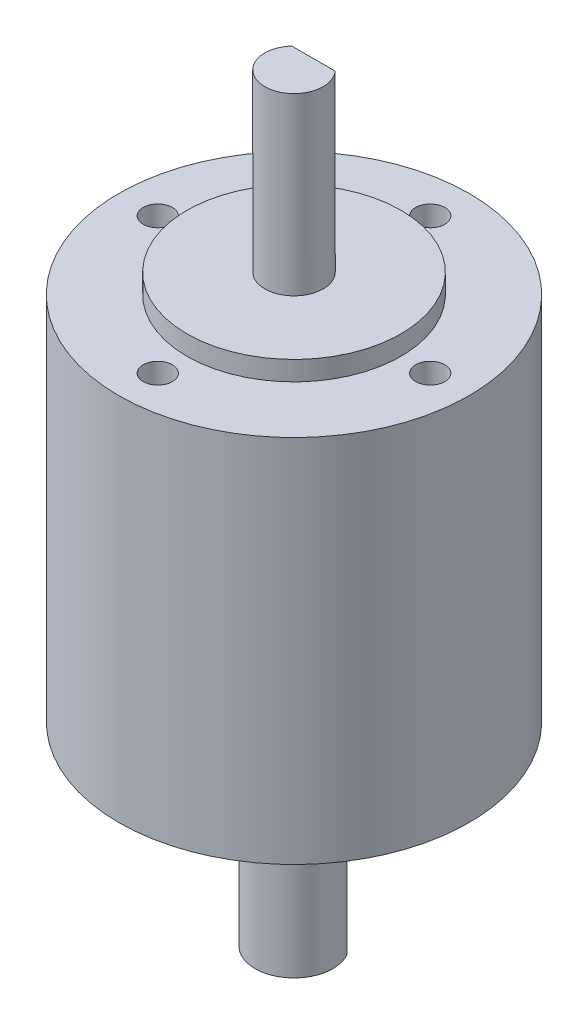
ISO-10303-21;
HEADER;
FILE_DESCRIPTION(('STEP AP214'),'2;1');
FILE_NAME('part.step','',(''),(''),'','','');
FILE_SCHEMA(('AUTOMOTIVE_DESIGN { 1 0 10303 214 1 1 1 1 }'));
ENDSEC;
DATA;
#1=APPLICATION_CONTEXT('core data for automotive mechanical design processes');
#2=APPLICATION_PROTOCOL_DEFINITION('international standard','automotive_design',2000,#1);
#3=PRODUCT_CONTEXT('',#1,'mechanical');
#4=PRODUCT('Part','Part','',(#3));
#5=PRODUCT_RELATED_PRODUCT_CATEGORY('part','',(#4));
#6=PRODUCT_DEFINITION_FORMATION('','',#4);
#7=PRODUCT_DEFINITION_CONTEXT('part definition',#1,'design');
#8=PRODUCT_DEFINITION('design','',#6,#7);
#9=PRODUCT_DEFINITION_SHAPE('','',#8);
#10=(LENGTH_UNIT() NAMED_UNIT(*) SI_UNIT(.MILLI.,.METRE.));
#11=(NAMED_UNIT(*) PLANE_ANGLE_UNIT() SI_UNIT($,.RADIAN.));
#12=(NAMED_UNIT(*) SI_UNIT($,.STERADIAN.) SOLID_ANGLE_UNIT());
#13=UNCERTAINTY_MEASURE_WITH_UNIT(LENGTH_MEASURE(1.E-05),#10,'distance_accuracy_value','');
#14=(GEOMETRIC_REPRESENTATION_CONTEXT(3) GLOBAL_UNCERTAINTY_ASSIGNED_CONTEXT((#13)) GLOBAL_UNIT_ASSIGNED_CONTEXT((#10,
#11,#12)) REPRESENTATION_CONTEXT('',''));
#15=CARTESIAN_POINT('',(0.,0.,0.));
#16=DIRECTION('',(0.,0.,1.));
#17=DIRECTION('',(1.,0.,0.));
#18=AXIS2_PLACEMENT_3D('',#15,#16,#17);
#19=CARTESIAN_POINT('',(0.,38.,0.));
#20=DIRECTION('',(0.,-1.,0.));
#21=DIRECTION('',(0.,0.,-1.));
#22=AXIS2_PLACEMENT_3D('',#19,#20,#21);
#23=CYLINDRICAL_SURFACE('',#22,18.);
#24=CARTESIAN_POINT('',(0.,38.,0.));
#25=DIRECTION('',(0.,1.,0.));
#26=DIRECTION('',(0.,0.,1.));
#27=AXIS2_PLACEMENT_3D('',#24,#25,#26);
#28=CIRCLE('',#27,18.);
#29=CARTESIAN_POINT('',(0.,38.,18.));
#30=VERTEX_POINT('',#29);
#31=EDGE_CURVE('E127',#30,#30,#28,.T.);
#32=ORIENTED_EDGE('',*,*,#31,.F.);
#33=EDGE_LOOP('',(#32));
#34=FACE_BOUND('',#33,.T.);
#35=CARTESIAN_POINT('',(0.,0.,0.));
#36=DIRECTION('',(0.,1.,0.));
#37=DIRECTION('',(0.,0.,1.));
#38=AXIS2_PLACEMENT_3D('',#35,#36,#37);
#39=CIRCLE('',#38,18.);
#40=CARTESIAN_POINT('',(0.,0.,18.));
#41=VERTEX_POINT('',#40);
#42=EDGE_CURVE('E123',#41,#41,#39,.T.);
#43=ORIENTED_EDGE('',*,*,#42,.T.);
#44=EDGE_LOOP('',(#43));
#45=FACE_BOUND('',#44,.T.);
#46=ADVANCED_FACE('F40',(#34,#45),#23,.T.);
#47=CARTESIAN_POINT('',(0.,38.,0.));
#48=DIRECTION('',(0.,1.,0.));
#49=DIRECTION('',(0.,0.,1.));
#50=AXIS2_PLACEMENT_3D('',#47,#48,#49);
#51=PLANE('',#50);
#52=CARTESIAN_POINT('',(-14.,38.,0.));
#53=DIRECTION('',(0.,1.,0.));
#54=DIRECTION('',(0.,0.,1.));
#55=AXIS2_PLACEMENT_3D('',#52,#53,#54);
#56=CIRCLE('',#55,1.5);
#57=CARTESIAN_POINT('',(-14.,38.,1.5));
#58=VERTEX_POINT('',#57);
#59=EDGE_CURVE('E538',#58,#58,#56,.T.);
#60=ORIENTED_EDGE('',*,*,#59,.F.);
#61=EDGE_LOOP('',(#60));
#62=FACE_BOUND('',#61,.T.);
#63=CARTESIAN_POINT('',(0.,38.,-14.));
#64=DIRECTION('',(0.,1.,0.));
#65=DIRECTION('',(0.,0.,1.));
#66=AXIS2_PLACEMENT_3D('',#63,#64,#65);
#67=CIRCLE('',#66,1.5);
#68=CARTESIAN_POINT('',(0.,38.,-12.5));
#69=VERTEX_POINT('',#68);
#70=EDGE_CURVE('E548',#69,#69,#67,.T.);
#71=ORIENTED_EDGE('',*,*,#70,.F.);
#72=EDGE_LOOP('',(#71));
#73=FACE_BOUND('',#72,.T.);
#74=CARTESIAN_POINT('',(14.,38.,0.));
#75=DIRECTION('',(0.,1.,0.));
#76=DIRECTION('',(0.,0.,1.));
#77=AXIS2_PLACEMENT_3D('',#74,#75,#76);
#78=CIRCLE('',#77,1.5);
#79=CARTESIAN_POINT('',(14.,38.,1.5));
#80=VERTEX_POINT('',#79);
#81=EDGE_CURVE('E554',#80,#80,#78,.T.);
#82=ORIENTED_EDGE('',*,*,#81,.F.);
#83=EDGE_LOOP('',(#82));
#84=FACE_BOUND('',#83,.T.);
#85=CARTESIAN_POINT('',(0.,38.,14.));
#86=DIRECTION('',(0.,1.,0.));
#87=DIRECTION('',(0.,0.,1.));
#88=AXIS2_PLACEMENT_3D('',#85,#86,#87);
#89=CIRCLE('',#88,1.5);
#90=CARTESIAN_POINT('',(0.,38.,15.5));
#91=VERTEX_POINT('',#90);
#92=EDGE_CURVE('E561',#91,#91,#89,.T.);
#93=ORIENTED_EDGE('',*,*,#92,.F.);
#94=EDGE_LOOP('',(#93));
#95=FACE_BOUND('',#94,.T.);
#96=CARTESIAN_POINT('',(0.,38.,0.));
#97=DIRECTION('',(0.,1.,0.));
#98=DIRECTION('',(0.,0.,1.));
#99=AXIS2_PLACEMENT_3D('',#96,#97,#98);
#100=CIRCLE('',#99,11.);
#101=CARTESIAN_POINT('',(0.,38.,11.));
#102=VERTEX_POINT('',#101);
#103=EDGE_CURVE('E120',#102,#102,#100,.T.);
#104=ORIENTED_EDGE('',*,*,#103,.F.);
#105=EDGE_LOOP('',(#104));
#106=FACE_BOUND('',#105,.T.);
#107=ORIENTED_EDGE('',*,*,#31,.T.);
#108=EDGE_LOOP('',(#107));
#109=FACE_BOUND('',#108,.T.);
#110=ADVANCED_FACE('F211',(#62,#73,#84,#95,#106,#109),#51,.T.);
#111=CARTESIAN_POINT('',(0.,0.,0.));
#112=DIRECTION('',(0.,1.,0.));
#113=DIRECTION('',(0.,0.,1.));
#114=AXIS2_PLACEMENT_3D('',#111,#112,#113);
#115=PLANE('',#114);
#116=CARTESIAN_POINT('',(0.,0.,14.));
#117=DIRECTION('',(0.,-1.,0.));
#118=DIRECTION('',(0.,0.,-1.));
#119=AXIS2_PLACEMENT_3D('',#116,#117,#118);
#120=CIRCLE('',#119,1.5);
#121=CARTESIAN_POINT('',(0.,0.,12.5));
#122=VERTEX_POINT('',#121);
#123=EDGE_CURVE('E160',#122,#122,#120,.T.);
#124=ORIENTED_EDGE('',*,*,#123,.F.);
#125=EDGE_LOOP('',(#124));
#126=FACE_BOUND('',#125,.T.);
#127=CARTESIAN_POINT('',(14.,0.,0.));
#128=DIRECTION('',(0.,-1.,0.));
#129=DIRECTION('',(0.,0.,-1.));
#130=AXIS2_PLACEMENT_3D('',#127,#128,#129);
#131=CIRCLE('',#130,1.5);
#132=CARTESIAN_POINT('',(14.,0.,-1.5));
#133=VERTEX_POINT('',#132);
#134=EDGE_CURVE('E172',#133,#133,#131,.T.);
#135=ORIENTED_EDGE('',*,*,#134,.F.);
#136=EDGE_LOOP('',(#135));
#137=FACE_BOUND('',#136,.T.);
#138=CARTESIAN_POINT('',(0.,0.,-14.));
#139=DIRECTION('',(0.,-1.,0.));
#140=DIRECTION('',(0.,0.,-1.));
#141=AXIS2_PLACEMENT_3D('',#138,#139,#140);
#142=CIRCLE('',#141,1.5);
#143=CARTESIAN_POINT('',(0.,0.,-15.5));
#144=VERTEX_POINT('',#143);
#145=EDGE_CURVE('E183',#144,#144,#142,.T.);
#146=ORIENTED_EDGE('',*,*,#145,.F.);
#147=EDGE_LOOP('',(#146));
#148=FACE_BOUND('',#147,.T.);
#149=CARTESIAN_POINT('',(-14.,0.,0.));
#150=DIRECTION('',(0.,-1.,0.));
#151=DIRECTION('',(0.,0.,-1.));
#152=AXIS2_PLACEMENT_3D('',#149,#150,#151);
#153=CIRCLE('',#152,1.5);
#154=CARTESIAN_POINT('',(-14.,0.,-1.5));
#155=VERTEX_POINT('',#154);
#156=EDGE_CURVE('E191',#155,#155,#153,.T.);
#157=ORIENTED_EDGE('',*,*,#156,.F.);
#158=EDGE_LOOP('',(#157));
#159=FACE_BOUND('',#158,.T.);
#160=CARTESIAN_POINT('',(0.,0.,0.));
#161=DIRECTION('',(0.,-1.,0.));
#162=DIRECTION('',(0.,0.,-1.));
#163=AXIS2_PLACEMENT_3D('',#160,#161,#162);
#164=CIRCLE('',#163,11.);
#165=CARTESIAN_POINT('',(0.,0.,-11.));
#166=VERTEX_POINT('',#165);
#167=EDGE_CURVE('E115',#166,#166,#164,.T.);
#168=ORIENTED_EDGE('',*,*,#167,.F.);
#169=EDGE_LOOP('',(#168));
#170=FACE_BOUND('',#169,.T.);
#171=ORIENTED_EDGE('',*,*,#42,.F.);
#172=EDGE_LOOP('',(#171));
#173=FACE_BOUND('',#172,.T.);
#174=ADVANCED_FACE('F216',(#126,#137,#148,#159,#170,#173),#115,.F.);
#175=CARTESIAN_POINT('',(0.,40.,0.));
#176=DIRECTION('',(0.,-1.,0.));
#177=DIRECTION('',(0.,0.,-1.));
#178=AXIS2_PLACEMENT_3D('',#175,#176,#177);
#179=CYLINDRICAL_SURFACE('',#178,11.);
#180=CARTESIAN_POINT('',(0.,40.,0.));
#181=DIRECTION('',(0.,1.,0.));
#182=DIRECTION('',(0.,0.,1.));
#183=AXIS2_PLACEMENT_3D('',#180,#181,#182);
#184=CIRCLE('',#183,11.);
#185=CARTESIAN_POINT('',(0.,40.,11.));
#186=VERTEX_POINT('',#185);
#187=EDGE_CURVE('E104',#186,#186,#184,.T.);
#188=ORIENTED_EDGE('',*,*,#187,.F.);
#189=EDGE_LOOP('',(#188));
#190=FACE_BOUND('',#189,.T.);
#191=ORIENTED_EDGE('',*,*,#103,.T.);
#192=EDGE_LOOP('',(#191));
#193=FACE_BOUND('',#192,.T.);
#194=ADVANCED_FACE('F224',(#190,#193),#179,.T.);
#195=CARTESIAN_POINT('',(0.,40.,0.));
#196=DIRECTION('',(0.,1.,0.));
#197=DIRECTION('',(0.,0.,1.));
#198=AXIS2_PLACEMENT_3D('',#195,#196,#197);
#199=PLANE('',#198);
#200=CARTESIAN_POINT('',(0.,40.,0.));
#201=DIRECTION('',(0.,1.,0.));
#202=DIRECTION('',(0.,0.,1.));
#203=AXIS2_PLACEMENT_3D('',#200,#201,#202);
#204=CIRCLE('',#203,3.);
#205=CARTESIAN_POINT('',(0.,40.,3.));
#206=VERTEX_POINT('',#205);
#207=EDGE_CURVE('E111',#206,#206,#204,.T.);
#208=ORIENTED_EDGE('',*,*,#207,.F.);
#209=EDGE_LOOP('',(#208));
#210=FACE_BOUND('',#209,.T.);
#211=ORIENTED_EDGE('',*,*,#187,.T.);
#212=EDGE_LOOP('',(#211));
#213=FACE_BOUND('',#212,.T.);
#214=ADVANCED_FACE('F229',(#210,#213),#199,.T.);
#215=CARTESIAN_POINT('',(0.,-2.,0.));
#216=DIRECTION('',(0.,1.,0.));
#217=DIRECTION('',(0.,0.,1.));
#218=AXIS2_PLACEMENT_3D('',#215,#216,#217);
#219=CYLINDRICAL_SURFACE('',#218,11.);
#220=CARTESIAN_POINT('',(0.,-2.,0.));
#221=DIRECTION('',(0.,-1.,0.));
#222=DIRECTION('',(0.,0.,-1.));
#223=AXIS2_PLACEMENT_3D('',#220,#221,#222);
#224=CIRCLE('',#223,11.);
#225=CARTESIAN_POINT('',(0.,-2.,-11.));
#226=VERTEX_POINT('',#225);
#227=EDGE_CURVE('E98',#226,#226,#224,.T.);
#228=ORIENTED_EDGE('',*,*,#227,.F.);
#229=EDGE_LOOP('',(#228));
#230=FACE_BOUND('',#229,.T.);
#231=ORIENTED_EDGE('',*,*,#167,.T.);
#232=EDGE_LOOP('',(#231));
#233=FACE_BOUND('',#232,.T.);
#234=ADVANCED_FACE('F236',(#230,#233),#219,.T.);
#235=CARTESIAN_POINT('',(0.,-2.,0.));
#236=DIRECTION('',(0.,-1.,0.));
#237=DIRECTION('',(0.,0.,-1.));
#238=AXIS2_PLACEMENT_3D('',#235,#236,#237);
#239=PLANE('',#238);
#240=CARTESIAN_POINT('',(0.,-2.,0.));
#241=DIRECTION('',(0.,-1.,0.));
#242=DIRECTION('',(0.,0.,-1.));
#243=AXIS2_PLACEMENT_3D('',#240,#241,#242);
#244=CIRCLE('',#243,4.);
#245=CARTESIAN_POINT('',(0.,-2.,-4.));
#246=VERTEX_POINT('',#245);
#247=EDGE_CURVE('E112',#246,#246,#244,.T.);
#248=ORIENTED_EDGE('',*,*,#247,.F.);
#249=EDGE_LOOP('',(#248));
#250=FACE_BOUND('',#249,.T.);
#251=ORIENTED_EDGE('',*,*,#227,.T.);
#252=EDGE_LOOP('',(#251));
#253=FACE_BOUND('',#252,.T.);
#254=ADVANCED_FACE('F240',(#250,#253),#239,.T.);
#255=CARTESIAN_POINT('',(0.,-20.,0.));
#256=DIRECTION('',(0.,1.,0.));
#257=DIRECTION('',(0.,0.,1.));
#258=AXIS2_PLACEMENT_3D('',#255,#256,#257);
#259=CYLINDRICAL_SURFACE('',#258,4.);
#260=CARTESIAN_POINT('',(0.,-20.,0.));
#261=DIRECTION('',(0.,-1.,0.));
#262=DIRECTION('',(0.,0.,-1.));
#263=AXIS2_PLACEMENT_3D('',#260,#261,#262);
#264=CIRCLE('',#263,4.);
#265=CARTESIAN_POINT('',(3.46410161513775,-20.,-2.));
#266=VERTEX_POINT('',#265);
#267=CARTESIAN_POINT('',(-3.46410161513775,-20.,-2.));
#268=VERTEX_POINT('',#267);
#269=EDGE_CURVE('E92',#266,#268,#264,.T.);
#270=ORIENTED_EDGE('',*,*,#269,.F.);
#271=DIRECTION('',(0.,1.,0.));
#272=VECTOR('',#271,1.);
#273=CARTESIAN_POINT('',(3.46410161513775,-20.,-2.));
#274=LINE('',#273,#272);
#275=CARTESIAN_POINT('',(3.46410161513775,-5.,-2.));
#276=VERTEX_POINT('',#275);
#277=EDGE_CURVE('E55',#266,#276,#274,.T.);
#278=ORIENTED_EDGE('',*,*,#277,.T.);
#279=CARTESIAN_POINT('',(0.,-5.,0.));
#280=DIRECTION('',(0.,-1.,0.));
#281=DIRECTION('',(0.,0.,-1.));
#282=AXIS2_PLACEMENT_3D('',#279,#280,#281);
#283=CIRCLE('',#282,4.);
#284=CARTESIAN_POINT('',(-3.46410161513775,-5.,-2.));
#285=VERTEX_POINT('',#284);
#286=EDGE_CURVE('E11',#285,#276,#283,.T.);
#287=ORIENTED_EDGE('',*,*,#286,.F.);
#288=DIRECTION('',(0.,1.,0.));
#289=VECTOR('',#288,1.);
#290=CARTESIAN_POINT('',(-3.46410161513775,-20.,-2.));
#291=LINE('',#290,#289);
#292=EDGE_CURVE('E81',#285,#268,#291,.F.);
#293=ORIENTED_EDGE('',*,*,#292,.T.);
#294=EDGE_LOOP('',(#270,#278,#287,#293));
#295=FACE_BOUND('',#294,.T.);
#296=ORIENTED_EDGE('',*,*,#247,.T.);
#297=EDGE_LOOP('',(#296));
#298=FACE_BOUND('',#297,.T.);
#299=ADVANCED_FACE('F90',(#295,#298),#259,.T.);
#300=CARTESIAN_POINT('',(0.,-20.,0.));
#301=DIRECTION('',(0.,-1.,0.));
#302=DIRECTION('',(0.,0.,-1.));
#303=AXIS2_PLACEMENT_3D('',#300,#301,#302);
#304=PLANE('',#303);
#305=DIRECTION('',(-1.,0.,0.));
#306=VECTOR('',#305,1.);
#307=CARTESIAN_POINT('',(0.,-20.,-2.));
#308=LINE('',#307,#306);
#309=EDGE_CURVE('E48',#266,#268,#308,.T.);
#310=ORIENTED_EDGE('',*,*,#309,.F.);
#311=ORIENTED_EDGE('',*,*,#269,.T.);
#312=EDGE_LOOP('',(#310,#311));
#313=FACE_BOUND('',#312,.T.);
#314=ADVANCED_FACE('F96',(#313),#304,.T.);
#315=CARTESIAN_POINT('',(0.,58.,0.));
#316=DIRECTION('',(0.,-1.,0.));
#317=DIRECTION('',(0.,0.,-1.));
#318=AXIS2_PLACEMENT_3D('',#315,#316,#317);
#319=CYLINDRICAL_SURFACE('',#318,3.);
#320=CARTESIAN_POINT('',(0.,58.,0.));
#321=DIRECTION('',(0.,1.,0.));
#322=DIRECTION('',(0.,0.,1.));
#323=AXIS2_PLACEMENT_3D('',#320,#321,#322);
#324=CIRCLE('',#323,3.);
#325=CARTESIAN_POINT('',(-2.23606797749979,58.,-2.));
#326=VERTEX_POINT('',#325);
#327=CARTESIAN_POINT('',(2.23606797749979,58.,-2.));
#328=VERTEX_POINT('',#327);
#329=EDGE_CURVE('E99',#326,#328,#324,.T.);
#330=ORIENTED_EDGE('',*,*,#329,.F.);
#331=DIRECTION('',(0.,-1.,0.));
#332=VECTOR('',#331,1.);
#333=CARTESIAN_POINT('',(-2.23606797749979,58.,-2.));
#334=LINE('',#333,#332);
#335=CARTESIAN_POINT('',(-2.23606797749979,43.,-2.));
#336=VERTEX_POINT('',#335);
#337=EDGE_CURVE('E63',#326,#336,#334,.T.);
#338=ORIENTED_EDGE('',*,*,#337,.T.);
#339=CARTESIAN_POINT('',(0.,43.,0.));
#340=DIRECTION('',(0.,-1.,0.));
#341=DIRECTION('',(0.,0.,-1.));
#342=AXIS2_PLACEMENT_3D('',#339,#340,#341);
#343=CIRCLE('',#342,3.);
#344=CARTESIAN_POINT('',(2.23606797749979,43.,-2.));
#345=VERTEX_POINT('',#344);
#346=EDGE_CURVE('E87',#336,#345,#343,.T.);
#347=ORIENTED_EDGE('',*,*,#346,.T.);
#348=DIRECTION('',(0.,-1.,0.));
#349=VECTOR('',#348,1.);
#350=CARTESIAN_POINT('',(2.23606797749979,58.,-2.));
#351=LINE('',#350,#349);
#352=EDGE_CURVE('E145',#345,#328,#351,.F.);
#353=ORIENTED_EDGE('',*,*,#352,.T.);
#354=EDGE_LOOP('',(#330,#338,#347,#353));
#355=FACE_BOUND('',#354,.T.);
#356=ORIENTED_EDGE('',*,*,#207,.T.);
#357=EDGE_LOOP('',(#356));
#358=FACE_BOUND('',#357,.T.);
#359=ADVANCED_FACE('F143',(#355,#358),#319,.T.);
#360=CARTESIAN_POINT('',(0.,58.,0.));
#361=DIRECTION('',(0.,1.,0.));
#362=DIRECTION('',(0.,0.,1.));
#363=AXIS2_PLACEMENT_3D('',#360,#361,#362);
#364=PLANE('',#363);
#365=DIRECTION('',(1.,0.,0.));
#366=VECTOR('',#365,1.);
#367=CARTESIAN_POINT('',(0.,58.,-2.));
#368=LINE('',#367,#366);
#369=EDGE_CURVE('E134',#326,#328,#368,.T.);
#370=ORIENTED_EDGE('',*,*,#369,.F.);
#371=ORIENTED_EDGE('',*,*,#329,.T.);
#372=EDGE_LOOP('',(#370,#371));
#373=FACE_BOUND('',#372,.T.);
#374=ADVANCED_FACE('F251',(#373),#364,.T.);
#375=CARTESIAN_POINT('',(0.,43.,0.));
#376=DIRECTION('',(0.,-1.,0.));
#377=DIRECTION('',(0.,0.,-1.));
#378=AXIS2_PLACEMENT_3D('',#375,#376,#377);
#379=PLANE('',#378);
#380=DIRECTION('',(1.,0.,0.));
#381=VECTOR('',#380,1.);
#382=CARTESIAN_POINT('',(-4.7940074906367,43.,-2.));
#383=LINE('',#382,#381);
#384=EDGE_CURVE('E149',#336,#345,#383,.T.);
#385=ORIENTED_EDGE('',*,*,#384,.T.);
#386=ORIENTED_EDGE('',*,*,#346,.F.);
#387=EDGE_LOOP('',(#385,#386));
#388=FACE_BOUND('',#387,.T.);
#389=ADVANCED_FACE('F148',(#388),#379,.F.);
#390=CARTESIAN_POINT('',(-4.7940074906367,43.,-2.));
#391=DIRECTION('',(0.,0.,1.));
#392=DIRECTION('',(1.,0.,0.));
#393=AXIS2_PLACEMENT_3D('',#390,#391,#392);
#394=PLANE('',#393);
#395=ORIENTED_EDGE('',*,*,#369,.T.);
#396=ORIENTED_EDGE('',*,*,#352,.F.);
#397=ORIENTED_EDGE('',*,*,#384,.F.);
#398=ORIENTED_EDGE('',*,*,#337,.F.);
#399=EDGE_LOOP('',(#395,#396,#397,#398));
#400=FACE_BOUND('',#399,.T.);
#401=ADVANCED_FACE('F150',(#400),#394,.F.);
#402=CARTESIAN_POINT('',(0.,-5.,0.));
#403=DIRECTION('',(0.,-1.,0.));
#404=DIRECTION('',(0.,0.,-1.));
#405=AXIS2_PLACEMENT_3D('',#402,#403,#404);
#406=PLANE('',#405);
#407=ORIENTED_EDGE('',*,*,#286,.T.);
#408=DIRECTION('',(-1.,0.,0.));
#409=VECTOR('',#408,1.);
#410=CARTESIAN_POINT('',(4.45842696629214,-5.,-2.));
#411=LINE('',#410,#409);
#412=EDGE_CURVE('E94',#276,#285,#411,.T.);
#413=ORIENTED_EDGE('',*,*,#412,.T.);
#414=EDGE_LOOP('',(#407,#413));
#415=FACE_BOUND('',#414,.T.);
#416=ADVANCED_FACE('F199',(#415),#406,.T.);
#417=CARTESIAN_POINT('',(4.45842696629214,-5.,-2.));
#418=DIRECTION('',(0.,0.,1.));
#419=DIRECTION('',(1.,0.,0.));
#420=AXIS2_PLACEMENT_3D('',#417,#418,#419);
#421=PLANE('',#420);
#422=ORIENTED_EDGE('',*,*,#309,.T.);
#423=ORIENTED_EDGE('',*,*,#292,.F.);
#424=ORIENTED_EDGE('',*,*,#412,.F.);
#425=ORIENTED_EDGE('',*,*,#277,.F.);
#426=EDGE_LOOP('',(#422,#423,#424,#425));
#427=FACE_BOUND('',#426,.T.);
#428=ADVANCED_FACE('F80',(#427),#421,.F.);
#429=CARTESIAN_POINT('',(-14.,6.,0.));
#430=DIRECTION('',(0.,-1.,0.));
#431=DIRECTION('',(0.,0.,-1.));
#432=AXIS2_PLACEMENT_3D('',#429,#430,#431);
#433=CYLINDRICAL_SURFACE('',#432,1.5);
#434=CARTESIAN_POINT('',(-14.,6.,0.));
#435=DIRECTION('',(0.,-1.,0.));
#436=DIRECTION('',(0.,0.,-1.));
#437=AXIS2_PLACEMENT_3D('',#434,#435,#436);
#438=CIRCLE('',#437,1.5);
#439=CARTESIAN_POINT('',(-14.,6.,-1.5));
#440=VERTEX_POINT('',#439);
#441=EDGE_CURVE('E187',#440,#440,#438,.T.);
#442=ORIENTED_EDGE('',*,*,#441,.F.);
#443=EDGE_LOOP('',(#442));
#444=FACE_BOUND('',#443,.T.);
#445=ORIENTED_EDGE('',*,*,#156,.T.);
#446=EDGE_LOOP('',(#445));
#447=FACE_BOUND('',#446,.T.);
#448=ADVANCED_FACE('F206',(#444,#447),#433,.F.);
#449=CARTESIAN_POINT('',(-14.,6.,0.));
#450=DIRECTION('',(0.,-1.,0.));
#451=DIRECTION('',(0.,0.,-1.));
#452=AXIS2_PLACEMENT_3D('',#449,#450,#451);
#453=PLANE('',#452);
#454=ORIENTED_EDGE('',*,*,#441,.T.);
#455=EDGE_LOOP('',(#454));
#456=FACE_BOUND('',#455,.T.);
#457=ADVANCED_FACE('F281',(#456),#453,.T.);
#458=CARTESIAN_POINT('',(0.,6.,-14.));
#459=DIRECTION('',(0.,-1.,0.));
#460=DIRECTION('',(0.,0.,-1.));
#461=AXIS2_PLACEMENT_3D('',#458,#459,#460);
#462=CYLINDRICAL_SURFACE('',#461,1.5);
#463=CARTESIAN_POINT('',(0.,6.,-14.));
#464=DIRECTION('',(0.,-1.,0.));
#465=DIRECTION('',(0.,0.,-1.));
#466=AXIS2_PLACEMENT_3D('',#463,#464,#465);
#467=CIRCLE('',#466,1.5);
#468=CARTESIAN_POINT('',(0.,6.,-15.5));
#469=VERTEX_POINT('',#468);
#470=EDGE_CURVE('E179',#469,#469,#467,.T.);
#471=ORIENTED_EDGE('',*,*,#470,.F.);
#472=EDGE_LOOP('',(#471));
#473=FACE_BOUND('',#472,.T.);
#474=ORIENTED_EDGE('',*,*,#145,.T.);
#475=EDGE_LOOP('',(#474));
#476=FACE_BOUND('',#475,.T.);
#477=ADVANCED_FACE('F289',(#473,#476),#462,.F.);
#478=CARTESIAN_POINT('',(0.,6.,-14.));
#479=DIRECTION('',(0.,-1.,0.));
#480=DIRECTION('',(0.,0.,-1.));
#481=AXIS2_PLACEMENT_3D('',#478,#479,#480);
#482=PLANE('',#481);
#483=ORIENTED_EDGE('',*,*,#470,.T.);
#484=EDGE_LOOP('',(#483));
#485=FACE_BOUND('',#484,.T.);
#486=ADVANCED_FACE('F298',(#485),#482,.T.);
#487=CARTESIAN_POINT('',(14.,6.,0.));
#488=DIRECTION('',(0.,-1.,0.));
#489=DIRECTION('',(0.,0.,-1.));
#490=AXIS2_PLACEMENT_3D('',#487,#488,#489);
#491=CYLINDRICAL_SURFACE('',#490,1.5);
#492=CARTESIAN_POINT('',(14.,6.,0.));
#493=DIRECTION('',(0.,-1.,0.));
#494=DIRECTION('',(0.,0.,-1.));
#495=AXIS2_PLACEMENT_3D('',#492,#493,#494);
#496=CIRCLE('',#495,1.5);
#497=CARTESIAN_POINT('',(14.,6.,-1.5));
#498=VERTEX_POINT('',#497);
#499=EDGE_CURVE('E163',#498,#498,#496,.T.);
#500=ORIENTED_EDGE('',*,*,#499,.F.);
#501=EDGE_LOOP('',(#500));
#502=FACE_BOUND('',#501,.T.);
#503=ORIENTED_EDGE('',*,*,#134,.T.);
#504=EDGE_LOOP('',(#503));
#505=FACE_BOUND('',#504,.T.);
#506=ADVANCED_FACE('F307',(#502,#505),#491,.F.);
#507=CARTESIAN_POINT('',(14.,6.,0.));
#508=DIRECTION('',(0.,-1.,0.));
#509=DIRECTION('',(0.,0.,-1.));
#510=AXIS2_PLACEMENT_3D('',#507,#508,#509);
#511=PLANE('',#510);
#512=ORIENTED_EDGE('',*,*,#499,.T.);
#513=EDGE_LOOP('',(#512));
#514=FACE_BOUND('',#513,.T.);
#515=ADVANCED_FACE('F316',(#514),#511,.T.);
#516=CARTESIAN_POINT('',(0.,6.,14.));
#517=DIRECTION('',(0.,-1.,0.));
#518=DIRECTION('',(0.,0.,-1.));
#519=AXIS2_PLACEMENT_3D('',#516,#517,#518);
#520=CYLINDRICAL_SURFACE('',#519,1.5);
#521=CARTESIAN_POINT('',(0.,6.,14.));
#522=DIRECTION('',(0.,-1.,0.));
#523=DIRECTION('',(0.,0.,-1.));
#524=AXIS2_PLACEMENT_3D('',#521,#522,#523);
#525=CIRCLE('',#524,1.5);
#526=CARTESIAN_POINT('',(0.,6.,12.5));
#527=VERTEX_POINT('',#526);
#528=EDGE_CURVE('E162',#527,#527,#525,.T.);
#529=ORIENTED_EDGE('',*,*,#528,.F.);
#530=EDGE_LOOP('',(#529));
#531=FACE_BOUND('',#530,.T.);
#532=ORIENTED_EDGE('',*,*,#123,.T.);
#533=EDGE_LOOP('',(#532));
#534=FACE_BOUND('',#533,.T.);
#535=ADVANCED_FACE('F325',(#531,#534),#520,.F.);
#536=CARTESIAN_POINT('',(0.,6.,14.));
#537=DIRECTION('',(0.,-1.,0.));
#538=DIRECTION('',(0.,0.,-1.));
#539=AXIS2_PLACEMENT_3D('',#536,#537,#538);
#540=PLANE('',#539);
#541=ORIENTED_EDGE('',*,*,#528,.T.);
#542=EDGE_LOOP('',(#541));
#543=FACE_BOUND('',#542,.T.);
#544=ADVANCED_FACE('F334',(#543),#540,.T.);
#545=CARTESIAN_POINT('',(0.,32.,14.));
#546=DIRECTION('',(0.,1.,0.));
#547=DIRECTION('',(0.,0.,1.));
#548=AXIS2_PLACEMENT_3D('',#545,#546,#547);
#549=CYLINDRICAL_SURFACE('',#548,1.5);
#550=CARTESIAN_POINT('',(0.,32.,14.));
#551=DIRECTION('',(0.,1.,0.));
#552=DIRECTION('',(0.,0.,1.));
#553=AXIS2_PLACEMENT_3D('',#550,#551,#552);
#554=CIRCLE('',#553,1.5);
#555=CARTESIAN_POINT('',(0.,32.,15.5));
#556=VERTEX_POINT('',#555);
#557=EDGE_CURVE('E558',#556,#556,#554,.T.);
#558=ORIENTED_EDGE('',*,*,#557,.F.);
#559=EDGE_LOOP('',(#558));
#560=FACE_BOUND('',#559,.T.);
#561=ORIENTED_EDGE('',*,*,#92,.T.);
#562=EDGE_LOOP('',(#561));
#563=FACE_BOUND('',#562,.T.);
#564=ADVANCED_FACE('F343',(#560,#563),#549,.F.);
#565=CARTESIAN_POINT('',(0.,32.,14.));
#566=DIRECTION('',(0.,1.,0.));
#567=DIRECTION('',(0.,0.,1.));
#568=AXIS2_PLACEMENT_3D('',#565,#566,#567);
#569=PLANE('',#568);
#570=ORIENTED_EDGE('',*,*,#557,.T.);
#571=EDGE_LOOP('',(#570));
#572=FACE_BOUND('',#571,.T.);
#573=ADVANCED_FACE('F353',(#572),#569,.T.);
#574=CARTESIAN_POINT('',(14.,32.,0.));
#575=DIRECTION('',(0.,1.,0.));
#576=DIRECTION('',(0.,0.,1.));
#577=AXIS2_PLACEMENT_3D('',#574,#575,#576);
#578=CYLINDRICAL_SURFACE('',#577,1.5);
#579=CARTESIAN_POINT('',(14.,32.,0.));
#580=DIRECTION('',(0.,1.,0.));
#581=DIRECTION('',(0.,0.,1.));
#582=AXIS2_PLACEMENT_3D('',#579,#580,#581);
#583=CIRCLE('',#582,1.5);
#584=CARTESIAN_POINT('',(14.,32.,1.5));
#585=VERTEX_POINT('',#584);
#586=EDGE_CURVE('E551',#585,#585,#583,.T.);
#587=ORIENTED_EDGE('',*,*,#586,.F.);
#588=EDGE_LOOP('',(#587));
#589=FACE_BOUND('',#588,.T.);
#590=ORIENTED_EDGE('',*,*,#81,.T.);
#591=EDGE_LOOP('',(#590));
#592=FACE_BOUND('',#591,.T.);
#593=ADVANCED_FACE('F362',(#589,#592),#578,.F.);
#594=CARTESIAN_POINT('',(14.,32.,0.));
#595=DIRECTION('',(0.,1.,0.));
#596=DIRECTION('',(0.,0.,1.));
#597=AXIS2_PLACEMENT_3D('',#594,#595,#596);
#598=PLANE('',#597);
#599=ORIENTED_EDGE('',*,*,#586,.T.);
#600=EDGE_LOOP('',(#599));
#601=FACE_BOUND('',#600,.T.);
#602=ADVANCED_FACE('F371',(#601),#598,.T.);
#603=CARTESIAN_POINT('',(0.,32.,-14.));
#604=DIRECTION('',(0.,1.,0.));
#605=DIRECTION('',(0.,0.,1.));
#606=AXIS2_PLACEMENT_3D('',#603,#604,#605);
#607=CYLINDRICAL_SURFACE('',#606,1.5);
#608=CARTESIAN_POINT('',(0.,32.,-14.));
#609=DIRECTION('',(0.,1.,0.));
#610=DIRECTION('',(0.,0.,1.));
#611=AXIS2_PLACEMENT_3D('',#608,#609,#610);
#612=CIRCLE('',#611,1.5);
#613=CARTESIAN_POINT('',(0.,32.,-12.5));
#614=VERTEX_POINT('',#613);
#615=EDGE_CURVE('E542',#614,#614,#612,.T.);
#616=ORIENTED_EDGE('',*,*,#615,.F.);
#617=EDGE_LOOP('',(#616));
#618=FACE_BOUND('',#617,.T.);
#619=ORIENTED_EDGE('',*,*,#70,.T.);
#620=EDGE_LOOP('',(#619));
#621=FACE_BOUND('',#620,.T.);
#622=ADVANCED_FACE('F380',(#618,#621),#607,.F.);
#623=CARTESIAN_POINT('',(0.,32.,-14.));
#624=DIRECTION('',(0.,1.,0.));
#625=DIRECTION('',(0.,0.,1.));
#626=AXIS2_PLACEMENT_3D('',#623,#624,#625);
#627=PLANE('',#626);
#628=ORIENTED_EDGE('',*,*,#615,.T.);
#629=EDGE_LOOP('',(#628));
#630=FACE_BOUND('',#629,.T.);
#631=ADVANCED_FACE('F389',(#630),#627,.T.);
#632=CARTESIAN_POINT('',(-14.,32.,0.));
#633=DIRECTION('',(0.,1.,0.));
#634=DIRECTION('',(0.,0.,1.));
#635=AXIS2_PLACEMENT_3D('',#632,#633,#634);
#636=CYLINDRICAL_SURFACE('',#635,1.5);
#637=CARTESIAN_POINT('',(-14.,32.,0.));
#638=DIRECTION('',(0.,1.,0.));
#639=DIRECTION('',(0.,0.,1.));
#640=AXIS2_PLACEMENT_3D('',#637,#638,#639);
#641=CIRCLE('',#640,1.5);
#642=CARTESIAN_POINT('',(-14.,32.,1.5));
#643=VERTEX_POINT('',#642);
#644=EDGE_CURVE('E195',#643,#643,#641,.T.);
#645=ORIENTED_EDGE('',*,*,#644,.F.);
#646=EDGE_LOOP('',(#645));
#647=FACE_BOUND('',#646,.T.);
#648=ORIENTED_EDGE('',*,*,#59,.T.);
#649=EDGE_LOOP('',(#648));
#650=FACE_BOUND('',#649,.T.);
#651=ADVANCED_FACE('F398',(#647,#650),#636,.F.);
#652=CARTESIAN_POINT('',(-14.,32.,0.));
#653=DIRECTION('',(0.,1.,0.));
#654=DIRECTION('',(0.,0.,1.));
#655=AXIS2_PLACEMENT_3D('',#652,#653,#654);
#656=PLANE('',#655);
#657=ORIENTED_EDGE('',*,*,#644,.T.);
#658=EDGE_LOOP('',(#657));
#659=FACE_BOUND('',#658,.T.);
#660=ADVANCED_FACE('F407',(#659),#656,.T.);
#661=CLOSED_SHELL('',(#46,#110,#174,#194,#214,#234,#254,#299,#314,#359,#374,#389,#401,#416,#428,
#448,#457,#477,#486,#506,#515,#535,#544,#564,#573,#593,#602,#622,#631,#651,#660));
#662=MANIFOLD_SOLID_BREP('B2',#661);
#663=ADVANCED_BREP_SHAPE_REPRESENTATION('',(#18,#662),#14);
#664=SHAPE_DEFINITION_REPRESENTATION(#9,#663);
ENDSEC;
END-ISO-10303-21;
